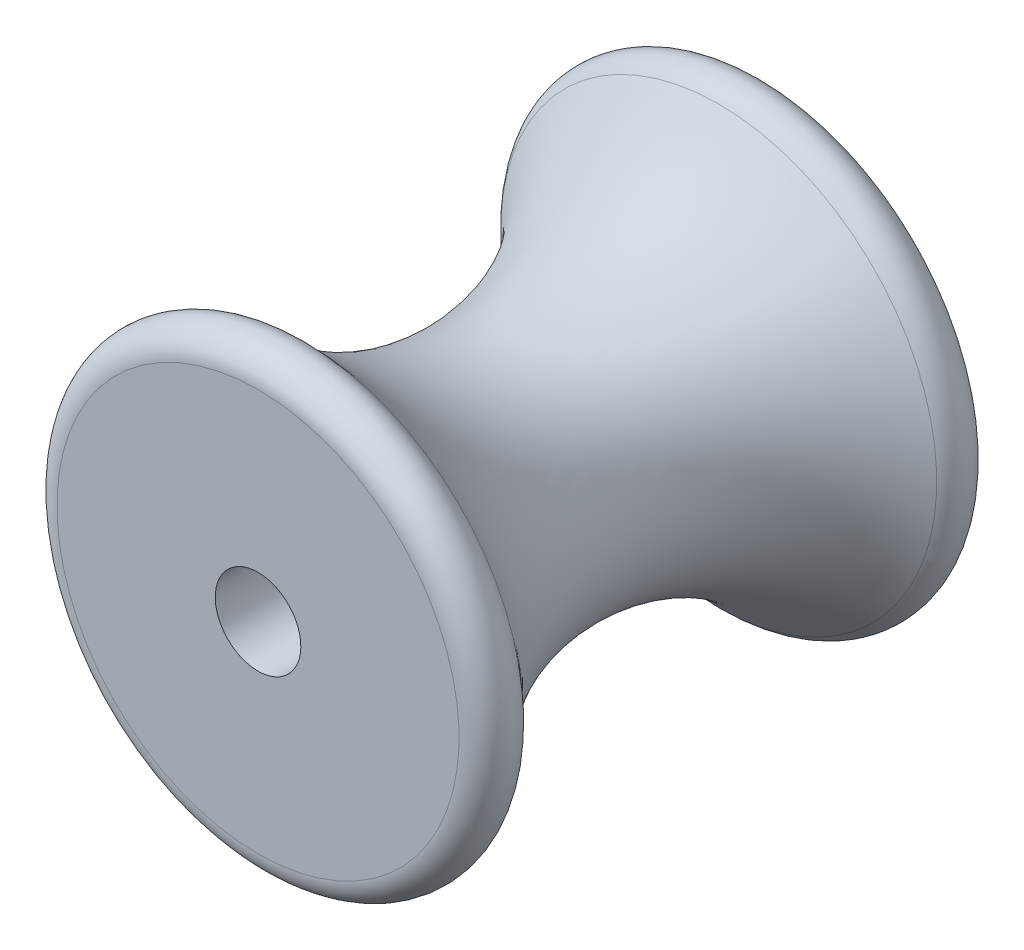
ISO-10303-21;
HEADER;
FILE_DESCRIPTION(('STEP AP214'),'2;1');
FILE_NAME('part.step','',(''),(''),'','','');
FILE_SCHEMA(('AUTOMOTIVE_DESIGN { 1 0 10303 214 1 1 1 1 }'));
ENDSEC;
DATA;
#1=APPLICATION_CONTEXT('core data for automotive mechanical design processes');
#2=APPLICATION_PROTOCOL_DEFINITION('international standard','automotive_design',2000,#1);
#3=PRODUCT_CONTEXT('',#1,'mechanical');
#4=PRODUCT('Part','Part','',(#3));
#5=PRODUCT_RELATED_PRODUCT_CATEGORY('part','',(#4));
#6=PRODUCT_DEFINITION_FORMATION('','',#4);
#7=PRODUCT_DEFINITION_CONTEXT('part definition',#1,'design');
#8=PRODUCT_DEFINITION('design','',#6,#7);
#9=PRODUCT_DEFINITION_SHAPE('','',#8);
#10=(LENGTH_UNIT() NAMED_UNIT(*) SI_UNIT(.MILLI.,.METRE.));
#11=(NAMED_UNIT(*) PLANE_ANGLE_UNIT() SI_UNIT($,.RADIAN.));
#12=(NAMED_UNIT(*) SI_UNIT($,.STERADIAN.) SOLID_ANGLE_UNIT());
#13=UNCERTAINTY_MEASURE_WITH_UNIT(LENGTH_MEASURE(1.E-05),#10,'distance_accuracy_value','');
#14=(GEOMETRIC_REPRESENTATION_CONTEXT(3) GLOBAL_UNCERTAINTY_ASSIGNED_CONTEXT((#13)) GLOBAL_UNIT_ASSIGNED_CONTEXT((#10,
#11,#12)) REPRESENTATION_CONTEXT('',''));
#15=CARTESIAN_POINT('',(0.,0.,0.));
#16=DIRECTION('',(0.,0.,1.));
#17=DIRECTION('',(1.,0.,0.));
#18=AXIS2_PLACEMENT_3D('',#15,#16,#17);
#19=CARTESIAN_POINT('',(0.,0.,-9.5));
#20=DIRECTION('',(0.,0.,-1.));
#21=DIRECTION('',(0.,1.,0.));
#22=AXIS2_PLACEMENT_3D('',#19,#20,#21);
#23=PLANE('',#22);
#24=CARTESIAN_POINT('',(0.,0.,-9.5));
#25=DIRECTION('',(0.,0.,-1.));
#26=DIRECTION('',(0.,1.,0.));
#27=AXIS2_PLACEMENT_3D('',#24,#25,#26);
#28=CIRCLE('',#27,7.51787997811553);
#29=CARTESIAN_POINT('',(0.,7.51787997811553,-9.5));
#30=VERTEX_POINT('',#29);
#31=EDGE_CURVE('E10',#30,#30,#28,.T.);
#32=ORIENTED_EDGE('',*,*,#31,.T.);
#33=EDGE_LOOP('',(#32));
#34=FACE_BOUND('',#33,.T.);
#35=CARTESIAN_POINT('',(0.,0.,-9.5));
#36=DIRECTION('',(0.,0.,-1.));
#37=DIRECTION('',(0.,1.,0.));
#38=AXIS2_PLACEMENT_3D('',#35,#36,#37);
#39=CIRCLE('',#38,1.60000000000001);
#40=CARTESIAN_POINT('',(0.,1.60000000000001,-9.5));
#41=VERTEX_POINT('',#40);
#42=EDGE_CURVE('E62',#41,#41,#39,.T.);
#43=ORIENTED_EDGE('',*,*,#42,.F.);
#44=EDGE_LOOP('',(#43));
#45=FACE_BOUND('',#44,.T.);
#46=ADVANCED_FACE('F39',(#34,#45),#23,.T.);
#47=CARTESIAN_POINT('',(0.,0.,0.));
#48=DIRECTION('',(0.,0.,-1.));
#49=DIRECTION('',(0.,1.,0.));
#50=AXIS2_PLACEMENT_3D('',#47,#48,#49);
#51=TOROIDAL_SURFACE('',#50,14.5,10.);
#52=CARTESIAN_POINT('',(0.,0.,7.72727272727272));
#53=DIRECTION('',(0.,0.,-1.));
#54=DIRECTION('',(0.,1.,0.));
#55=AXIS2_PLACEMENT_3D('',#52,#53,#54);
#56=CIRCLE('',#55,8.15261816192321);
#57=CARTESIAN_POINT('',(0.,8.15261816192321,7.72727272727273));
#58=VERTEX_POINT('',#57);
#59=EDGE_CURVE('E50',#58,#58,#56,.T.);
#60=ORIENTED_EDGE('',*,*,#59,.T.);
#61=EDGE_LOOP('',(#60));
#62=FACE_BOUND('',#61,.T.);
#63=CARTESIAN_POINT('',(0.,0.,-7.72727272727273));
#64=DIRECTION('',(0.,0.,1.));
#65=DIRECTION('',(0.,-1.,0.));
#66=AXIS2_PLACEMENT_3D('',#63,#64,#65);
#67=CIRCLE('',#66,8.15261816192321);
#68=CARTESIAN_POINT('',(0.,-8.15261816192321,-7.72727272727273));
#69=VERTEX_POINT('',#68);
#70=EDGE_CURVE('E54',#69,#69,#67,.T.);
#71=ORIENTED_EDGE('',*,*,#70,.T.);
#72=EDGE_LOOP('',(#71));
#73=FACE_BOUND('',#72,.T.);
#74=ADVANCED_FACE('F69',(#62,#73),#51,.F.);
#75=CARTESIAN_POINT('',(0.,0.,9.5));
#76=DIRECTION('',(0.,0.,-1.));
#77=DIRECTION('',(0.,1.,0.));
#78=AXIS2_PLACEMENT_3D('',#75,#76,#77);
#79=PLANE('',#78);
#80=CARTESIAN_POINT('',(0.,0.,9.5));
#81=DIRECTION('',(0.,0.,-1.));
#82=DIRECTION('',(0.,1.,0.));
#83=AXIS2_PLACEMENT_3D('',#80,#81,#82);
#84=CIRCLE('',#83,7.51787997811553);
#85=CARTESIAN_POINT('',(0.,7.51787997811553,9.5));
#86=VERTEX_POINT('',#85);
#87=EDGE_CURVE('E46',#86,#86,#84,.F.);
#88=ORIENTED_EDGE('',*,*,#87,.T.);
#89=EDGE_LOOP('',(#88));
#90=FACE_BOUND('',#89,.T.);
#91=CARTESIAN_POINT('',(0.,0.,9.5));
#92=DIRECTION('',(0.,0.,-1.));
#93=DIRECTION('',(0.,1.,0.));
#94=AXIS2_PLACEMENT_3D('',#91,#92,#93);
#95=CIRCLE('',#94,1.60000000000001);
#96=CARTESIAN_POINT('',(0.,1.6,9.5));
#97=VERTEX_POINT('',#96);
#98=EDGE_CURVE('E59',#97,#97,#95,.T.);
#99=ORIENTED_EDGE('',*,*,#98,.T.);
#100=EDGE_LOOP('',(#99));
#101=FACE_BOUND('',#100,.T.);
#102=ADVANCED_FACE('F75',(#90,#101),#79,.F.);
#103=CARTESIAN_POINT('',(0.,0.,-10.));
#104=DIRECTION('',(0.,0.,-1.));
#105=DIRECTION('',(0.,1.,0.));
#106=AXIS2_PLACEMENT_3D('',#103,#104,#105);
#107=CYLINDRICAL_SURFACE('',#106,1.60000000000001);
#108=ORIENTED_EDGE('',*,*,#98,.F.);
#109=EDGE_LOOP('',(#108));
#110=FACE_BOUND('',#109,.T.);
#111=ORIENTED_EDGE('',*,*,#42,.T.);
#112=EDGE_LOOP('',(#111));
#113=FACE_BOUND('',#112,.T.);
#114=ADVANCED_FACE('F66',(#110,#113),#107,.F.);
#115=CARTESIAN_POINT('',(0.,0.,8.5));
#116=DIRECTION('',(0.,0.,1.));
#117=DIRECTION('',(0.,-1.,0.));
#118=AXIS2_PLACEMENT_3D('',#115,#116,#117);
#119=TOROIDAL_SURFACE('',#118,7.51787997811553,1.);
#120=ORIENTED_EDGE('',*,*,#87,.F.);
#121=EDGE_LOOP('',(#120));
#122=FACE_BOUND('',#121,.T.);
#123=ORIENTED_EDGE('',*,*,#59,.F.);
#124=EDGE_LOOP('',(#123));
#125=FACE_BOUND('',#124,.T.);
#126=ADVANCED_FACE('F79',(#122,#125),#119,.T.);
#127=CARTESIAN_POINT('',(0.,0.,-8.5));
#128=DIRECTION('',(0.,0.,1.));
#129=DIRECTION('',(0.,-1.,0.));
#130=AXIS2_PLACEMENT_3D('',#127,#128,#129);
#131=TOROIDAL_SURFACE('',#130,7.51787997811553,1.);
#132=ORIENTED_EDGE('',*,*,#70,.F.);
#133=EDGE_LOOP('',(#132));
#134=FACE_BOUND('',#133,.T.);
#135=ORIENTED_EDGE('',*,*,#31,.F.);
#136=EDGE_LOOP('',(#135));
#137=FACE_BOUND('',#136,.T.);
#138=ADVANCED_FACE('F41',(#134,#137),#131,.T.);
#139=CLOSED_SHELL('',(#46,#74,#102,#114,#126,#138));
#140=MANIFOLD_SOLID_BREP('B2',#139);
#141=ADVANCED_BREP_SHAPE_REPRESENTATION('',(#18,#140),#14);
#142=SHAPE_DEFINITION_REPRESENTATION(#9,#141);
ENDSEC;
END-ISO-10303-21;
